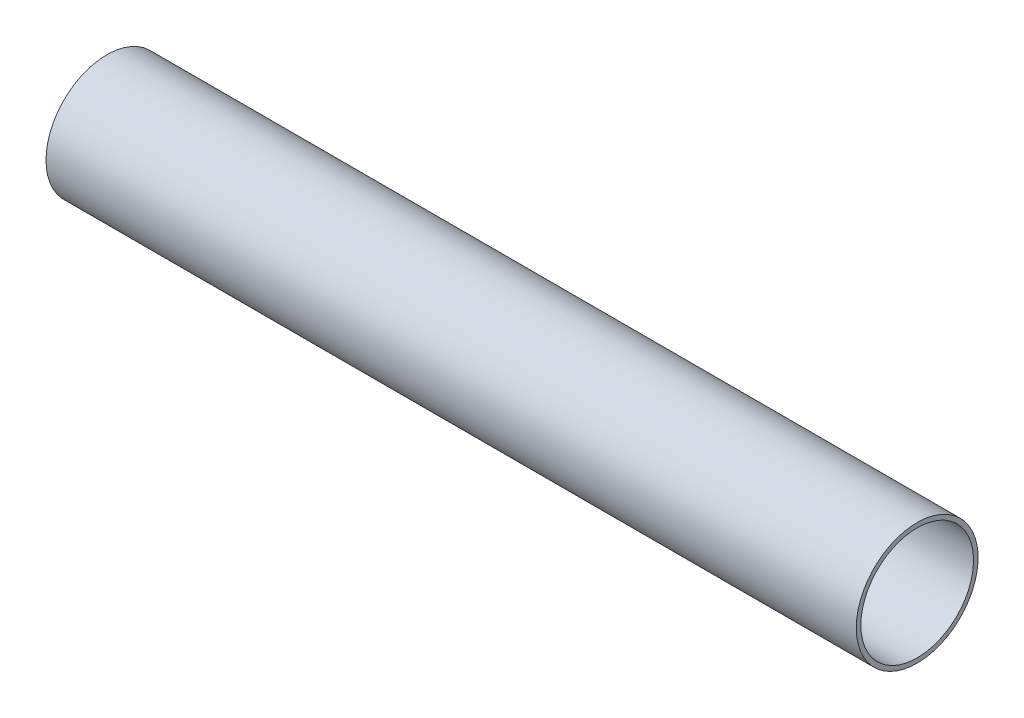
ISO-10303-21;
HEADER;
FILE_DESCRIPTION(('STEP AP214'),'2;1');
FILE_NAME('part.step','',(''),(''),'','','');
FILE_SCHEMA(('AUTOMOTIVE_DESIGN { 1 0 10303 214 1 1 1 1 }'));
ENDSEC;
DATA;
#1=APPLICATION_CONTEXT('core data for automotive mechanical design processes');
#2=APPLICATION_PROTOCOL_DEFINITION('international standard','automotive_design',2000,#1);
#3=PRODUCT_CONTEXT('',#1,'mechanical');
#4=PRODUCT('Part','Part','',(#3));
#5=PRODUCT_RELATED_PRODUCT_CATEGORY('part','',(#4));
#6=PRODUCT_DEFINITION_FORMATION('','',#4);
#7=PRODUCT_DEFINITION_CONTEXT('part definition',#1,'design');
#8=PRODUCT_DEFINITION('design','',#6,#7);
#9=PRODUCT_DEFINITION_SHAPE('','',#8);
#10=(LENGTH_UNIT() NAMED_UNIT(*) SI_UNIT(.MILLI.,.METRE.));
#11=(NAMED_UNIT(*) PLANE_ANGLE_UNIT() SI_UNIT($,.RADIAN.));
#12=(NAMED_UNIT(*) SI_UNIT($,.STERADIAN.) SOLID_ANGLE_UNIT());
#13=UNCERTAINTY_MEASURE_WITH_UNIT(LENGTH_MEASURE(1.E-05),#10,'distance_accuracy_value','');
#14=(GEOMETRIC_REPRESENTATION_CONTEXT(3) GLOBAL_UNCERTAINTY_ASSIGNED_CONTEXT((#13)) GLOBAL_UNIT_ASSIGNED_CONTEXT((#10,
#11,#12)) REPRESENTATION_CONTEXT('',''));
#15=CARTESIAN_POINT('',(0.,0.,0.));
#16=DIRECTION('',(0.,0.,1.));
#17=DIRECTION('',(1.,0.,0.));
#18=AXIS2_PLACEMENT_3D('',#15,#16,#17);
#19=CARTESIAN_POINT('',(114.173,0.,0.));
#20=DIRECTION('',(1.,0.,0.));
#21=DIRECTION('',(0.,0.,-1.));
#22=AXIS2_PLACEMENT_3D('',#19,#20,#21);
#23=PLANE('',#22);
#24=CARTESIAN_POINT('',(114.173,0.,0.));
#25=DIRECTION('',(1.,0.,0.));
#26=DIRECTION('',(0.,0.,-1.));
#27=AXIS2_PLACEMENT_3D('',#24,#25,#26);
#28=CIRCLE('',#27,17.1714379493972);
#29=CARTESIAN_POINT('',(114.173,0.,17.1714379493972));
#30=VERTEX_POINT('',#29);
#31=EDGE_CURVE('E10',#30,#30,#28,.T.);
#32=ORIENTED_EDGE('',*,*,#31,.T.);
#33=EDGE_LOOP('',(#32));
#34=FACE_BOUND('',#33,.T.);
#35=CARTESIAN_POINT('',(114.173,0.,0.));
#36=DIRECTION('',(1.,0.,0.));
#37=DIRECTION('',(0.,0.,-1.));
#38=AXIS2_PLACEMENT_3D('',#35,#36,#37);
#39=CIRCLE('',#38,15.875);
#40=CARTESIAN_POINT('',(114.173,0.,15.875));
#41=VERTEX_POINT('',#40);
#42=EDGE_CURVE('E46',#41,#41,#39,.T.);
#43=ORIENTED_EDGE('',*,*,#42,.F.);
#44=EDGE_LOOP('',(#43));
#45=FACE_BOUND('',#44,.T.);
#46=ADVANCED_FACE('F35',(#34,#45),#23,.T.);
#47=CARTESIAN_POINT('',(-114.173,0.,0.));
#48=DIRECTION('',(1.,0.,0.));
#49=DIRECTION('',(0.,0.,-1.));
#50=AXIS2_PLACEMENT_3D('',#47,#48,#49);
#51=PLANE('',#50);
#52=CARTESIAN_POINT('',(-114.173,0.,0.));
#53=DIRECTION('',(1.,0.,0.));
#54=DIRECTION('',(0.,0.,-1.));
#55=AXIS2_PLACEMENT_3D('',#52,#53,#54);
#56=CIRCLE('',#55,17.1714379493972);
#57=CARTESIAN_POINT('',(-114.173,0.,17.1714379493972));
#58=VERTEX_POINT('',#57);
#59=EDGE_CURVE('E39',#58,#58,#56,.T.);
#60=ORIENTED_EDGE('',*,*,#59,.F.);
#61=EDGE_LOOP('',(#60));
#62=FACE_BOUND('',#61,.T.);
#63=CARTESIAN_POINT('',(-114.173,0.,0.));
#64=DIRECTION('',(1.,0.,0.));
#65=DIRECTION('',(0.,0.,-1.));
#66=AXIS2_PLACEMENT_3D('',#63,#64,#65);
#67=CIRCLE('',#66,15.875);
#68=CARTESIAN_POINT('',(-114.173,0.,15.875));
#69=VERTEX_POINT('',#68);
#70=EDGE_CURVE('E48',#69,#69,#67,.T.);
#71=ORIENTED_EDGE('',*,*,#70,.T.);
#72=EDGE_LOOP('',(#71));
#73=FACE_BOUND('',#72,.T.);
#74=ADVANCED_FACE('F58',(#62,#73),#51,.F.);
#75=CARTESIAN_POINT('',(114.173,0.,0.));
#76=DIRECTION('',(-1.,0.,0.));
#77=DIRECTION('',(0.,0.,1.));
#78=AXIS2_PLACEMENT_3D('',#75,#76,#77);
#79=CYLINDRICAL_SURFACE('',#78,17.1714379493972);
#80=CARTESIAN_POINT('',(114.173,0.,17.1714379493972));
#81=CARTESIAN_POINT('',(111.794395833333,0.,17.1714379493972));
#82=CARTESIAN_POINT('',(109.415791666667,0.,17.1714379493972));
#83=CARTESIAN_POINT('',(104.658583333333,0.,17.1714379493972));
#84=CARTESIAN_POINT('',(102.279979166667,0.,17.1714379493972));
#85=CARTESIAN_POINT('',(97.5227708333333,0.,17.1714379493972));
#86=CARTESIAN_POINT('',(95.1441666666666,0.,17.1714379493972));
#87=CARTESIAN_POINT('',(90.3869583333333,0.,17.1714379493972));
#88=CARTESIAN_POINT('',(88.0083541666666,0.,17.1714379493972));
#89=CARTESIAN_POINT('',(83.2511458333333,0.,17.1714379493972));
#90=CARTESIAN_POINT('',(80.8725416666667,0.,17.1714379493972));
#91=CARTESIAN_POINT('',(76.1153333333333,0.,17.1714379493972));
#92=CARTESIAN_POINT('',(73.7367291666666,0.,17.1714379493972));
#93=CARTESIAN_POINT('',(68.9795208333333,0.,17.1714379493972));
#94=CARTESIAN_POINT('',(66.6009166666667,0.,17.1714379493972));
#95=CARTESIAN_POINT('',(61.8437083333333,0.,17.1714379493972));
#96=CARTESIAN_POINT('',(59.4651041666666,0.,17.1714379493972));
#97=CARTESIAN_POINT('',(54.7078958333333,0.,17.1714379493972));
#98=CARTESIAN_POINT('',(52.3292916666667,0.,17.1714379493972));
#99=CARTESIAN_POINT('',(47.5720833333333,0.,17.1714379493972));
#100=CARTESIAN_POINT('',(45.1934791666667,0.,17.1714379493972));
#101=CARTESIAN_POINT('',(40.4362708333333,0.,17.1714379493972));
#102=CARTESIAN_POINT('',(38.0576666666667,0.,17.1714379493972));
#103=CARTESIAN_POINT('',(33.3004583333333,0.,17.1714379493972));
#104=CARTESIAN_POINT('',(30.9218541666667,0.,17.1714379493972));
#105=CARTESIAN_POINT('',(26.1646458333333,0.,17.1714379493972));
#106=CARTESIAN_POINT('',(23.7860416666667,0.,17.1714379493972));
#107=CARTESIAN_POINT('',(19.0288333333333,0.,17.1714379493972));
#108=CARTESIAN_POINT('',(16.6502291666667,0.,17.1714379493972));
#109=CARTESIAN_POINT('',(11.8930208333333,0.,17.1714379493972));
#110=CARTESIAN_POINT('',(9.51441666666666,0.,17.1714379493972));
#111=CARTESIAN_POINT('',(4.75720833333332,0.,17.1714379493972));
#112=CARTESIAN_POINT('',(2.37860416666665,0.,17.1714379493972));
#113=CARTESIAN_POINT('',(-2.37860416666668,0.,17.1714379493972));
#114=CARTESIAN_POINT('',(-4.75720833333335,0.,17.1714379493972));
#115=CARTESIAN_POINT('',(-9.51441666666668,0.,17.1714379493972));
#116=CARTESIAN_POINT('',(-11.8930208333333,0.,17.1714379493972));
#117=CARTESIAN_POINT('',(-16.6502291666667,0.,17.1714379493972));
#118=CARTESIAN_POINT('',(-19.0288333333333,0.,17.1714379493972));
#119=CARTESIAN_POINT('',(-23.7860416666667,0.,17.1714379493972));
#120=CARTESIAN_POINT('',(-26.1646458333333,0.,17.1714379493972));
#121=CARTESIAN_POINT('',(-30.9218541666667,0.,17.1714379493972));
#122=CARTESIAN_POINT('',(-33.3004583333333,0.,17.1714379493972));
#123=CARTESIAN_POINT('',(-38.0576666666667,0.,17.1714379493972));
#124=CARTESIAN_POINT('',(-40.4362708333333,0.,17.1714379493972));
#125=CARTESIAN_POINT('',(-45.1934791666667,0.,17.1714379493972));
#126=CARTESIAN_POINT('',(-47.5720833333333,0.,17.1714379493972));
#127=CARTESIAN_POINT('',(-52.3292916666667,0.,17.1714379493972));
#128=CARTESIAN_POINT('',(-54.7078958333333,0.,17.1714379493972));
#129=CARTESIAN_POINT('',(-59.4651041666667,0.,17.1714379493972));
#130=CARTESIAN_POINT('',(-61.8437083333334,0.,17.1714379493972));
#131=CARTESIAN_POINT('',(-66.6009166666667,0.,17.1714379493972));
#132=CARTESIAN_POINT('',(-68.9795208333334,0.,17.1714379493972));
#133=CARTESIAN_POINT('',(-73.7367291666667,0.,17.1714379493972));
#134=CARTESIAN_POINT('',(-76.1153333333334,0.,17.1714379493972));
#135=CARTESIAN_POINT('',(-80.8725416666667,0.,17.1714379493972));
#136=CARTESIAN_POINT('',(-83.2511458333333,0.,17.1714379493972));
#137=CARTESIAN_POINT('',(-88.0083541666667,0.,17.1714379493972));
#138=CARTESIAN_POINT('',(-90.3869583333333,0.,17.1714379493972));
#139=CARTESIAN_POINT('',(-95.1441666666667,0.,17.1714379493972));
#140=CARTESIAN_POINT('',(-97.5227708333333,0.,17.1714379493972));
#141=CARTESIAN_POINT('',(-102.279979166667,0.,17.1714379493972));
#142=CARTESIAN_POINT('',(-104.658583333333,0.,17.1714379493972));
#143=CARTESIAN_POINT('',(-109.415791666667,0.,17.1714379493972));
#144=CARTESIAN_POINT('',(-111.794395833333,0.,17.1714379493972));
#145=CARTESIAN_POINT('',(-114.173,0.,17.1714379493972));
#146=B_SPLINE_CURVE_WITH_KNOTS('',3,(#80,#81,#82,#83,#84,#85,#86,#87,#88,#89,#90,#91,#92,#93,
#94,#95,#96,#97,#98,#99,#100,#101,#102,#103,#104,#105,#106,#107,#108,#109,#110,#111,#112,#113,
#114,#115,#116,#117,#118,#119,#120,#121,#122,#123,#124,#125,#126,#127,#128,#129,#130,#131,#132,
#133,#134,#135,#136,#137,#138,#139,#140,#141,#142,#143,#144,#145),.UNSPECIFIED.,.F.,.F.,(4,2,2,
2,2,2,2,2,2,2,2,2,2,2,2,2,2,2,2,2,2,2,2,2,2,2,2,2,2,2,2,2,4),(0.,7.13581250000001,14.271625,
21.4074375,28.54325,35.6790625,42.814875,49.9506875,57.0865,64.2223125,71.358125,78.4939375,
85.62975,92.7655625,99.901375,107.0371875,114.173,121.3088125,128.444625,135.5804375,142.71625,
149.8520625,156.987875,164.1236875,171.2595,178.3953125,185.531125,192.6669375,199.80275,
206.9385625,214.074375,221.2101875,228.346),.UNSPECIFIED.);
#147=EDGE_CURVE('BSEAM37',#30,#58,#146,.T.);
#148=ORIENTED_EDGE('',*,*,#31,.F.);
#149=ORIENTED_EDGE('',*,*,#59,.T.);
#150=ORIENTED_EDGE('',*,*,#147,.T.);
#151=ORIENTED_EDGE('',*,*,#147,.F.);
#152=EDGE_LOOP('',(#148,#150,#149,#151));
#153=FACE_BOUND('',#152,.T.);
#154=ADVANCED_FACE('F37',(#153),#79,.T.);
#155=CARTESIAN_POINT('',(114.173,0.,0.));
#156=DIRECTION('',(-1.,0.,0.));
#157=DIRECTION('',(0.,0.,1.));
#158=AXIS2_PLACEMENT_3D('',#155,#156,#157);
#159=CYLINDRICAL_SURFACE('',#158,15.875);
#160=CARTESIAN_POINT('',(114.173,0.,15.875));
#161=CARTESIAN_POINT('',(111.794395833333,0.,15.875));
#162=CARTESIAN_POINT('',(109.415791666667,0.,15.875));
#163=CARTESIAN_POINT('',(104.658583333333,0.,15.875));
#164=CARTESIAN_POINT('',(102.279979166667,0.,15.875));
#165=CARTESIAN_POINT('',(97.5227708333333,0.,15.875));
#166=CARTESIAN_POINT('',(95.1441666666666,0.,15.875));
#167=CARTESIAN_POINT('',(90.3869583333333,0.,15.875));
#168=CARTESIAN_POINT('',(88.0083541666666,0.,15.875));
#169=CARTESIAN_POINT('',(83.2511458333333,0.,15.875));
#170=CARTESIAN_POINT('',(80.8725416666667,0.,15.875));
#171=CARTESIAN_POINT('',(76.1153333333333,0.,15.875));
#172=CARTESIAN_POINT('',(73.7367291666666,0.,15.875));
#173=CARTESIAN_POINT('',(68.9795208333333,0.,15.875));
#174=CARTESIAN_POINT('',(66.6009166666667,0.,15.875));
#175=CARTESIAN_POINT('',(61.8437083333333,0.,15.875));
#176=CARTESIAN_POINT('',(59.4651041666666,0.,15.875));
#177=CARTESIAN_POINT('',(54.7078958333333,0.,15.875));
#178=CARTESIAN_POINT('',(52.3292916666666,0.,15.875));
#179=CARTESIAN_POINT('',(47.5720833333333,0.,15.875));
#180=CARTESIAN_POINT('',(45.1934791666666,0.,15.875));
#181=CARTESIAN_POINT('',(40.4362708333333,0.,15.875));
#182=CARTESIAN_POINT('',(38.0576666666666,0.,15.875));
#183=CARTESIAN_POINT('',(33.3004583333333,0.,15.875));
#184=CARTESIAN_POINT('',(30.9218541666666,0.,15.875));
#185=CARTESIAN_POINT('',(26.1646458333333,0.,15.875));
#186=CARTESIAN_POINT('',(23.7860416666666,0.,15.875));
#187=CARTESIAN_POINT('',(19.0288333333333,0.,15.875));
#188=CARTESIAN_POINT('',(16.6502291666666,0.,15.875));
#189=CARTESIAN_POINT('',(11.8930208333333,0.,15.875));
#190=CARTESIAN_POINT('',(9.51441666666665,0.,15.875));
#191=CARTESIAN_POINT('',(4.75720833333331,0.,15.875));
#192=CARTESIAN_POINT('',(2.37860416666664,0.,15.875));
#193=CARTESIAN_POINT('',(-2.3786041666667,0.,15.875));
#194=CARTESIAN_POINT('',(-4.75720833333336,0.,15.875));
#195=CARTESIAN_POINT('',(-9.51441666666669,0.,15.875));
#196=CARTESIAN_POINT('',(-11.8930208333334,0.,15.875));
#197=CARTESIAN_POINT('',(-16.6502291666667,0.,15.875));
#198=CARTESIAN_POINT('',(-19.0288333333333,0.,15.875));
#199=CARTESIAN_POINT('',(-23.7860416666667,0.,15.875));
#200=CARTESIAN_POINT('',(-26.1646458333334,0.,15.875));
#201=CARTESIAN_POINT('',(-30.9218541666667,0.,15.875));
#202=CARTESIAN_POINT('',(-33.3004583333333,0.,15.875));
#203=CARTESIAN_POINT('',(-38.0576666666667,0.,15.875));
#204=CARTESIAN_POINT('',(-40.4362708333333,0.,15.875));
#205=CARTESIAN_POINT('',(-45.1934791666667,0.,15.875));
#206=CARTESIAN_POINT('',(-47.5720833333333,0.,15.875));
#207=CARTESIAN_POINT('',(-52.3292916666667,0.,15.875));
#208=CARTESIAN_POINT('',(-54.7078958333333,0.,15.875));
#209=CARTESIAN_POINT('',(-59.4651041666667,0.,15.875));
#210=CARTESIAN_POINT('',(-61.8437083333334,0.,15.875));
#211=CARTESIAN_POINT('',(-66.6009166666667,0.,15.875));
#212=CARTESIAN_POINT('',(-68.9795208333334,0.,15.875));
#213=CARTESIAN_POINT('',(-73.7367291666667,0.,15.875));
#214=CARTESIAN_POINT('',(-76.1153333333334,0.,15.875));
#215=CARTESIAN_POINT('',(-80.8725416666667,0.,15.875));
#216=CARTESIAN_POINT('',(-83.2511458333333,0.,15.875));
#217=CARTESIAN_POINT('',(-88.0083541666667,0.,15.875));
#218=CARTESIAN_POINT('',(-90.3869583333333,0.,15.875));
#219=CARTESIAN_POINT('',(-95.1441666666667,0.,15.875));
#220=CARTESIAN_POINT('',(-97.5227708333333,0.,15.875));
#221=CARTESIAN_POINT('',(-102.279979166667,0.,15.875));
#222=CARTESIAN_POINT('',(-104.658583333333,0.,15.875));
#223=CARTESIAN_POINT('',(-109.415791666667,0.,15.875));
#224=CARTESIAN_POINT('',(-111.794395833333,0.,15.875));
#225=CARTESIAN_POINT('',(-114.173,0.,15.875));
#226=B_SPLINE_CURVE_WITH_KNOTS('',3,(#160,#161,#162,#163,#164,#165,#166,#167,#168,#169,#170,
#171,#172,#173,#174,#175,#176,#177,#178,#179,#180,#181,#182,#183,#184,#185,#186,#187,#188,#189,
#190,#191,#192,#193,#194,#195,#196,#197,#198,#199,#200,#201,#202,#203,#204,#205,#206,#207,#208,
#209,#210,#211,#212,#213,#214,#215,#216,#217,#218,#219,#220,#221,#222,#223,#224,#225),
.UNSPECIFIED.,.F.,.F.,(4,2,2,2,2,2,2,2,2,2,2,2,2,2,2,2,2,2,2,2,2,2,2,2,2,2,2,2,2,2,2,2,4),(0.,
7.13581249999999,14.271625,21.4074375,28.54325,35.6790625,42.814875,49.9506875,57.0865,
64.2223125,71.358125,78.4939375,85.62975,92.7655625,99.901375,107.0371875,114.173,121.3088125,
128.444625,135.5804375,142.71625,149.8520625,156.987875,164.1236875,171.2595,178.3953125,
185.531125,192.6669375,199.80275,206.9385625,214.074375,221.2101875,228.346),.UNSPECIFIED.);
#227=EDGE_CURVE('BSEAM54',#41,#69,#226,.T.);
#228=ORIENTED_EDGE('',*,*,#42,.T.);
#229=ORIENTED_EDGE('',*,*,#70,.F.);
#230=ORIENTED_EDGE('',*,*,#227,.T.);
#231=ORIENTED_EDGE('',*,*,#227,.F.);
#232=EDGE_LOOP('',(#228,#230,#229,#231));
#233=FACE_BOUND('',#232,.T.);
#234=ADVANCED_FACE('F54',(#233),#159,.F.);
#235=CLOSED_SHELL('',(#46,#74,#154,#234));
#236=MANIFOLD_SOLID_BREP('B2',#235);
#237=ADVANCED_BREP_SHAPE_REPRESENTATION('',(#18,#236),#14);
#238=SHAPE_DEFINITION_REPRESENTATION(#9,#237);
ENDSEC;
END-ISO-10303-21;
